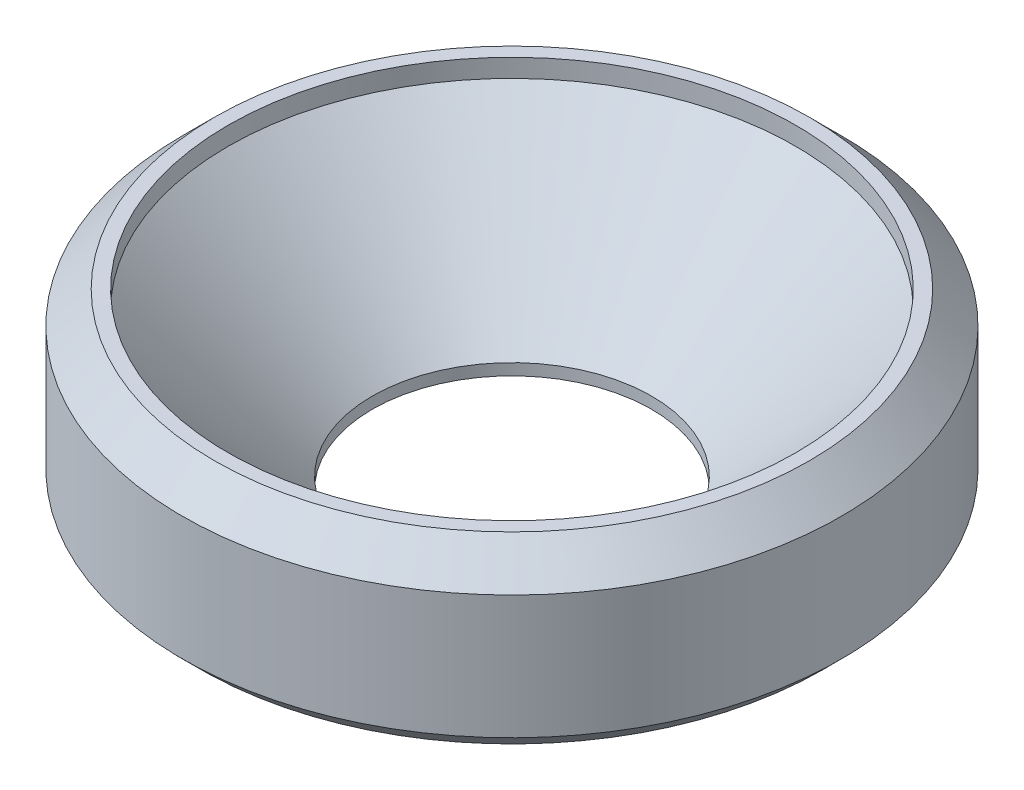
ISO-10303-21;
HEADER;
FILE_DESCRIPTION(('STEP AP214'),'2;1');
FILE_NAME('part.step','',(''),(''),'','','');
FILE_SCHEMA(('AUTOMOTIVE_DESIGN { 1 0 10303 214 1 1 1 1 }'));
ENDSEC;
DATA;
#1=APPLICATION_CONTEXT('core data for automotive mechanical design processes');
#2=APPLICATION_PROTOCOL_DEFINITION('international standard','automotive_design',2000,#1);
#3=PRODUCT_CONTEXT('',#1,'mechanical');
#4=PRODUCT('Part','Part','',(#3));
#5=PRODUCT_RELATED_PRODUCT_CATEGORY('part','',(#4));
#6=PRODUCT_DEFINITION_FORMATION('','',#4);
#7=PRODUCT_DEFINITION_CONTEXT('part definition',#1,'design');
#8=PRODUCT_DEFINITION('design','',#6,#7);
#9=PRODUCT_DEFINITION_SHAPE('','',#8);
#10=(LENGTH_UNIT() NAMED_UNIT(*) SI_UNIT(.MILLI.,.METRE.));
#11=(NAMED_UNIT(*) PLANE_ANGLE_UNIT() SI_UNIT($,.RADIAN.));
#12=(NAMED_UNIT(*) SI_UNIT($,.STERADIAN.) SOLID_ANGLE_UNIT());
#13=UNCERTAINTY_MEASURE_WITH_UNIT(LENGTH_MEASURE(1.E-05),#10,'distance_accuracy_value','');
#14=(GEOMETRIC_REPRESENTATION_CONTEXT(3) GLOBAL_UNCERTAINTY_ASSIGNED_CONTEXT((#13)) GLOBAL_UNIT_ASSIGNED_CONTEXT((#10,
#11,#12)) REPRESENTATION_CONTEXT('',''));
#15=CARTESIAN_POINT('',(0.,0.,0.));
#16=DIRECTION('',(0.,0.,1.));
#17=DIRECTION('',(1.,0.,0.));
#18=AXIS2_PLACEMENT_3D('',#15,#16,#17);
#19=CARTESIAN_POINT('',(0.,0.399999999999998,0.));
#20=DIRECTION('',(0.,1.,0.));
#21=DIRECTION('',(-1.,0.,0.));
#22=AXIS2_PLACEMENT_3D('',#19,#20,#21);
#23=CONICAL_SURFACE('',#22,7.2,0.785398163397446);
#24=CARTESIAN_POINT('',(0.,0.,0.));
#25=DIRECTION('',(0.,1.,0.));
#26=DIRECTION('',(-1.,0.,0.));
#27=AXIS2_PLACEMENT_3D('',#24,#25,#26);
#28=CIRCLE('',#27,6.8);
#29=CARTESIAN_POINT('',(-6.8,0.,0.));
#30=VERTEX_POINT('',#29);
#31=EDGE_CURVE('E67',#30,#30,#28,.T.);
#32=ORIENTED_EDGE('',*,*,#31,.T.);
#33=EDGE_LOOP('',(#32));
#34=FACE_BOUND('',#33,.T.);
#35=CARTESIAN_POINT('',(0.,0.399999999999998,0.));
#36=DIRECTION('',(0.,1.,0.));
#37=DIRECTION('',(-1.,0.,0.));
#38=AXIS2_PLACEMENT_3D('',#35,#36,#37);
#39=CIRCLE('',#38,7.2);
#40=CARTESIAN_POINT('',(-7.19999999999999,0.399999999999997,0.));
#41=VERTEX_POINT('',#40);
#42=EDGE_CURVE('E10',#41,#41,#39,.T.);
#43=ORIENTED_EDGE('',*,*,#42,.F.);
#44=EDGE_LOOP('',(#43));
#45=FACE_BOUND('',#44,.T.);
#46=ADVANCED_FACE('F39',(#34,#45),#23,.T.);
#47=CARTESIAN_POINT('',(0.,35.7053309248808,0.));
#48=DIRECTION('',(0.,1.,0.));
#49=DIRECTION('',(-1.,0.,0.));
#50=AXIS2_PLACEMENT_3D('',#47,#48,#49);
#51=CYLINDRICAL_SURFACE('',#50,7.2);
#52=ORIENTED_EDGE('',*,*,#42,.T.);
#53=EDGE_LOOP('',(#52));
#54=FACE_BOUND('',#53,.T.);
#55=CARTESIAN_POINT('',(0.,3.1,0.));
#56=DIRECTION('',(0.,1.,0.));
#57=DIRECTION('',(-1.,0.,0.));
#58=AXIS2_PLACEMENT_3D('',#55,#56,#57);
#59=CIRCLE('',#58,7.2);
#60=CARTESIAN_POINT('',(-7.19999999999999,3.1,0.));
#61=VERTEX_POINT('',#60);
#62=EDGE_CURVE('E45',#61,#61,#59,.T.);
#63=ORIENTED_EDGE('',*,*,#62,.F.);
#64=EDGE_LOOP('',(#63));
#65=FACE_BOUND('',#64,.T.);
#66=ADVANCED_FACE('F85',(#54,#65),#51,.T.);
#67=CARTESIAN_POINT('',(0.,3.8,0.));
#68=DIRECTION('',(0.,-1.,0.));
#69=DIRECTION('',(1.,0.,0.));
#70=AXIS2_PLACEMENT_3D('',#67,#68,#69);
#71=CONICAL_SURFACE('',#70,6.49999999999999,0.785398163397454);
#72=ORIENTED_EDGE('',*,*,#62,.T.);
#73=EDGE_LOOP('',(#72));
#74=FACE_BOUND('',#73,.T.);
#75=CARTESIAN_POINT('',(0.,3.8,0.));
#76=DIRECTION('',(0.,1.,0.));
#77=DIRECTION('',(-1.,0.,0.));
#78=AXIS2_PLACEMENT_3D('',#75,#76,#77);
#79=CIRCLE('',#78,6.49999999999999);
#80=CARTESIAN_POINT('',(-6.49999999999999,3.8,0.));
#81=VERTEX_POINT('',#80);
#82=EDGE_CURVE('E49',#81,#81,#79,.T.);
#83=ORIENTED_EDGE('',*,*,#82,.F.);
#84=EDGE_LOOP('',(#83));
#85=FACE_BOUND('',#84,.T.);
#86=ADVANCED_FACE('F89',(#74,#85),#71,.T.);
#87=CARTESIAN_POINT('',(-6.49999999999999,3.8,0.));
#88=DIRECTION('',(0.,1.,0.));
#89=DIRECTION('',(-1.,0.,0.));
#90=AXIS2_PLACEMENT_3D('',#87,#88,#89);
#91=PLANE('',#90);
#92=ORIENTED_EDGE('',*,*,#82,.T.);
#93=EDGE_LOOP('',(#92));
#94=FACE_BOUND('',#93,.T.);
#95=CARTESIAN_POINT('',(0.,3.8,0.));
#96=DIRECTION('',(0.,1.,0.));
#97=DIRECTION('',(-1.,0.,0.));
#98=AXIS2_PLACEMENT_3D('',#95,#96,#97);
#99=CIRCLE('',#98,6.2);
#100=CARTESIAN_POINT('',(-6.2,3.8,0.));
#101=VERTEX_POINT('',#100);
#102=EDGE_CURVE('E53',#101,#101,#99,.T.);
#103=ORIENTED_EDGE('',*,*,#102,.F.);
#104=EDGE_LOOP('',(#103));
#105=FACE_BOUND('',#104,.T.);
#106=ADVANCED_FACE('F93',(#94,#105),#91,.T.);
#107=CARTESIAN_POINT('',(0.,35.7053309248808,0.));
#108=DIRECTION('',(0.,1.,0.));
#109=DIRECTION('',(-1.,0.,0.));
#110=AXIS2_PLACEMENT_3D('',#107,#108,#109);
#111=CYLINDRICAL_SURFACE('',#110,6.2);
#112=ORIENTED_EDGE('',*,*,#102,.T.);
#113=EDGE_LOOP('',(#112));
#114=FACE_BOUND('',#113,.T.);
#115=CARTESIAN_POINT('',(0.,3.4,0.));
#116=DIRECTION('',(0.,1.,0.));
#117=DIRECTION('',(-1.,0.,0.));
#118=AXIS2_PLACEMENT_3D('',#115,#116,#117);
#119=CIRCLE('',#118,6.2);
#120=CARTESIAN_POINT('',(-6.2,3.4,0.));
#121=VERTEX_POINT('',#120);
#122=EDGE_CURVE('E58',#121,#121,#119,.T.);
#123=ORIENTED_EDGE('',*,*,#122,.F.);
#124=EDGE_LOOP('',(#123));
#125=FACE_BOUND('',#124,.T.);
#126=ADVANCED_FACE('F99',(#114,#125),#111,.F.);
#127=CARTESIAN_POINT('',(0.,0.249999999999966,0.));
#128=DIRECTION('',(0.,1.,0.));
#129=DIRECTION('',(-1.,0.,0.));
#130=AXIS2_PLACEMENT_3D('',#127,#128,#129);
#131=CONICAL_SURFACE('',#130,3.05,0.785398163397443);
#132=ORIENTED_EDGE('',*,*,#122,.T.);
#133=EDGE_LOOP('',(#132));
#134=FACE_BOUND('',#133,.T.);
#135=CARTESIAN_POINT('',(0.,0.249999999999966,0.));
#136=DIRECTION('',(0.,1.,0.));
#137=DIRECTION('',(-1.,0.,0.));
#138=AXIS2_PLACEMENT_3D('',#135,#136,#137);
#139=CIRCLE('',#138,3.05);
#140=CARTESIAN_POINT('',(-3.05,0.249999999999965,0.));
#141=VERTEX_POINT('',#140);
#142=EDGE_CURVE('E61',#141,#141,#139,.T.);
#143=ORIENTED_EDGE('',*,*,#142,.F.);
#144=EDGE_LOOP('',(#143));
#145=FACE_BOUND('',#144,.T.);
#146=ADVANCED_FACE('F81',(#134,#145),#131,.F.);
#147=CARTESIAN_POINT('',(0.,35.7053309248808,0.));
#148=DIRECTION('',(0.,1.,0.));
#149=DIRECTION('',(-1.,0.,0.));
#150=AXIS2_PLACEMENT_3D('',#147,#148,#149);
#151=CYLINDRICAL_SURFACE('',#150,3.05);
#152=ORIENTED_EDGE('',*,*,#142,.T.);
#153=EDGE_LOOP('',(#152));
#154=FACE_BOUND('',#153,.T.);
#155=CARTESIAN_POINT('',(0.,0.,0.));
#156=DIRECTION('',(0.,1.,0.));
#157=DIRECTION('',(-1.,0.,0.));
#158=AXIS2_PLACEMENT_3D('',#155,#156,#157);
#159=CIRCLE('',#158,3.05);
#160=CARTESIAN_POINT('',(-3.05,0.,0.));
#161=VERTEX_POINT('',#160);
#162=EDGE_CURVE('E64',#161,#161,#159,.T.);
#163=ORIENTED_EDGE('',*,*,#162,.F.);
#164=EDGE_LOOP('',(#163));
#165=FACE_BOUND('',#164,.T.);
#166=ADVANCED_FACE('F75',(#154,#165),#151,.F.);
#167=CARTESIAN_POINT('',(-6.8,0.,0.));
#168=DIRECTION('',(0.,-1.,0.));
#169=DIRECTION('',(1.,0.,0.));
#170=AXIS2_PLACEMENT_3D('',#167,#168,#169);
#171=PLANE('',#170);
#172=ORIENTED_EDGE('',*,*,#162,.T.);
#173=EDGE_LOOP('',(#172));
#174=FACE_BOUND('',#173,.T.);
#175=ORIENTED_EDGE('',*,*,#31,.F.);
#176=EDGE_LOOP('',(#175));
#177=FACE_BOUND('',#176,.T.);
#178=ADVANCED_FACE('F73',(#174,#177),#171,.T.);
#179=CLOSED_SHELL('',(#46,#66,#86,#106,#126,#146,#166,#178));
#180=MANIFOLD_SOLID_BREP('B2',#179);
#181=ADVANCED_BREP_SHAPE_REPRESENTATION('',(#18,#180),#14);
#182=SHAPE_DEFINITION_REPRESENTATION(#9,#181);
ENDSEC;
END-ISO-10303-21;
